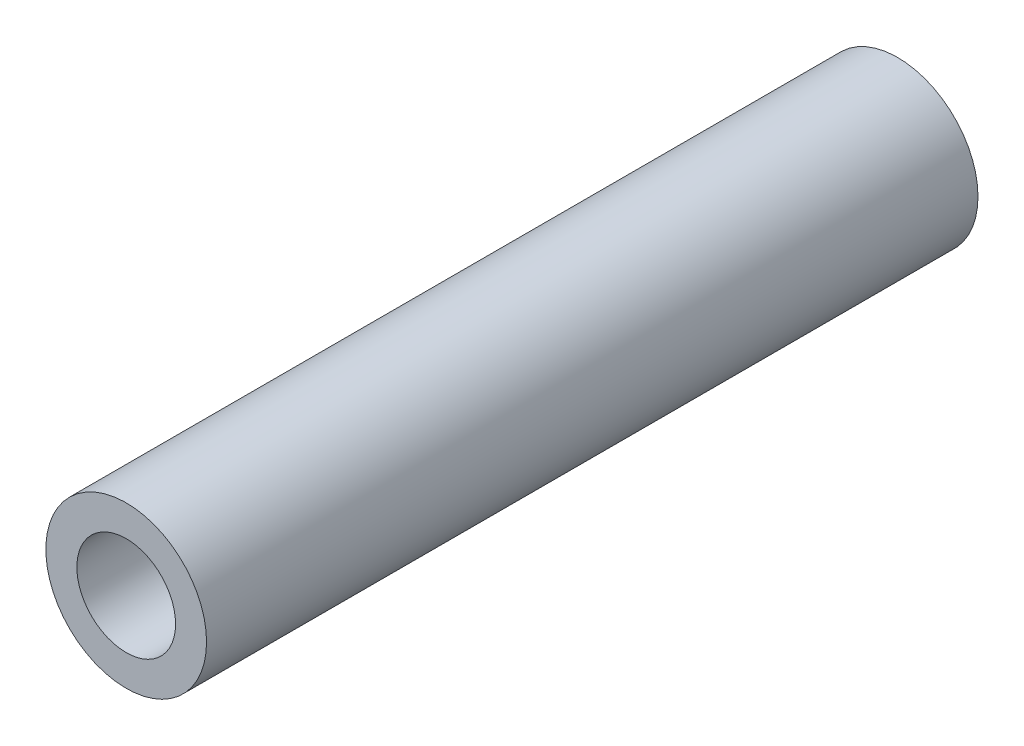
ISO-10303-21;
HEADER;
FILE_DESCRIPTION(('STEP AP214'),'2;1');
FILE_NAME('part.step','',(''),(''),'','','');
FILE_SCHEMA(('AUTOMOTIVE_DESIGN { 1 0 10303 214 1 1 1 1 }'));
ENDSEC;
DATA;
#1=APPLICATION_CONTEXT('core data for automotive mechanical design processes');
#2=APPLICATION_PROTOCOL_DEFINITION('international standard','automotive_design',2000,#1);
#3=PRODUCT_CONTEXT('',#1,'mechanical');
#4=PRODUCT('Part','Part','',(#3));
#5=PRODUCT_RELATED_PRODUCT_CATEGORY('part','',(#4));
#6=PRODUCT_DEFINITION_FORMATION('','',#4);
#7=PRODUCT_DEFINITION_CONTEXT('part definition',#1,'design');
#8=PRODUCT_DEFINITION('design','',#6,#7);
#9=PRODUCT_DEFINITION_SHAPE('','',#8);
#10=(LENGTH_UNIT() NAMED_UNIT(*) SI_UNIT(.MILLI.,.METRE.));
#11=(NAMED_UNIT(*) PLANE_ANGLE_UNIT() SI_UNIT($,.RADIAN.));
#12=(NAMED_UNIT(*) SI_UNIT($,.STERADIAN.) SOLID_ANGLE_UNIT());
#13=UNCERTAINTY_MEASURE_WITH_UNIT(LENGTH_MEASURE(1.E-05),#10,'distance_accuracy_value','');
#14=(GEOMETRIC_REPRESENTATION_CONTEXT(3) GLOBAL_UNCERTAINTY_ASSIGNED_CONTEXT((#13)) GLOBAL_UNIT_ASSIGNED_CONTEXT((#10,
#11,#12)) REPRESENTATION_CONTEXT('',''));
#15=CARTESIAN_POINT('',(0.,0.,0.));
#16=DIRECTION('',(0.,0.,1.));
#17=DIRECTION('',(1.,0.,0.));
#18=AXIS2_PLACEMENT_3D('',#15,#16,#17);
#19=CARTESIAN_POINT('',(0.,0.,19.05));
#20=DIRECTION('',(0.,0.,-1.));
#21=DIRECTION('',(-1.,0.,0.));
#22=AXIS2_PLACEMENT_3D('',#19,#20,#21);
#23=CYLINDRICAL_SURFACE('',#22,2.4384);
#24=CARTESIAN_POINT('',(0.,0.,19.05));
#25=DIRECTION('',(0.,0.,1.));
#26=DIRECTION('',(1.,0.,0.));
#27=AXIS2_PLACEMENT_3D('',#24,#25,#26);
#28=CIRCLE('',#27,2.4384);
#29=CARTESIAN_POINT('',(2.4384,0.,19.05));
#30=VERTEX_POINT('',#29);
#31=EDGE_CURVE('E54',#30,#30,#28,.T.);
#32=ORIENTED_EDGE('',*,*,#31,.T.);
#33=EDGE_LOOP('',(#32));
#34=FACE_BOUND('',#33,.T.);
#35=CARTESIAN_POINT('',(0.,0.,-19.05));
#36=DIRECTION('',(0.,0.,1.));
#37=DIRECTION('',(1.,0.,0.));
#38=AXIS2_PLACEMENT_3D('',#35,#36,#37);
#39=CIRCLE('',#38,2.4384);
#40=CARTESIAN_POINT('',(2.4384,0.,-19.05));
#41=VERTEX_POINT('',#40);
#42=EDGE_CURVE('E11',#41,#41,#39,.T.);
#43=ORIENTED_EDGE('',*,*,#42,.F.);
#44=EDGE_LOOP('',(#43));
#45=FACE_BOUND('',#44,.T.);
#46=ADVANCED_FACE('F16',(#34,#45),#23,.F.);
#47=CARTESIAN_POINT('',(0.,0.,19.05));
#48=DIRECTION('',(0.,0.,-1.));
#49=DIRECTION('',(-1.,0.,0.));
#50=AXIS2_PLACEMENT_3D('',#47,#48,#49);
#51=CYLINDRICAL_SURFACE('',#50,3.96875);
#52=CARTESIAN_POINT('',(0.,0.,19.05));
#53=DIRECTION('',(0.,0.,1.));
#54=DIRECTION('',(1.,0.,0.));
#55=AXIS2_PLACEMENT_3D('',#52,#53,#54);
#56=CIRCLE('',#55,3.96875);
#57=CARTESIAN_POINT('',(3.96875,0.,19.05));
#58=VERTEX_POINT('',#57);
#59=EDGE_CURVE('E20',#58,#58,#56,.T.);
#60=ORIENTED_EDGE('',*,*,#59,.F.);
#61=EDGE_LOOP('',(#60));
#62=FACE_BOUND('',#61,.T.);
#63=CARTESIAN_POINT('',(0.,0.,-19.05));
#64=DIRECTION('',(0.,0.,1.));
#65=DIRECTION('',(1.,0.,0.));
#66=AXIS2_PLACEMENT_3D('',#63,#64,#65);
#67=CIRCLE('',#66,3.96875);
#68=CARTESIAN_POINT('',(3.96875,0.,-19.05));
#69=VERTEX_POINT('',#68);
#70=EDGE_CURVE('E27',#69,#69,#67,.T.);
#71=ORIENTED_EDGE('',*,*,#70,.T.);
#72=EDGE_LOOP('',(#71));
#73=FACE_BOUND('',#72,.T.);
#74=ADVANCED_FACE('F83',(#62,#73),#51,.T.);
#75=CARTESIAN_POINT('',(0.,0.,-19.05));
#76=DIRECTION('',(0.,0.,1.));
#77=DIRECTION('',(1.,0.,0.));
#78=AXIS2_PLACEMENT_3D('',#75,#76,#77);
#79=PLANE('',#78);
#80=ORIENTED_EDGE('',*,*,#42,.T.);
#81=EDGE_LOOP('',(#80));
#82=FACE_BOUND('',#81,.T.);
#83=ORIENTED_EDGE('',*,*,#70,.F.);
#84=EDGE_LOOP('',(#83));
#85=FACE_BOUND('',#84,.T.);
#86=ADVANCED_FACE('F18',(#82,#85),#79,.F.);
#87=CARTESIAN_POINT('',(0.,0.,19.05));
#88=DIRECTION('',(0.,0.,1.));
#89=DIRECTION('',(1.,0.,0.));
#90=AXIS2_PLACEMENT_3D('',#87,#88,#89);
#91=PLANE('',#90);
#92=ORIENTED_EDGE('',*,*,#31,.F.);
#93=EDGE_LOOP('',(#92));
#94=FACE_BOUND('',#93,.T.);
#95=ORIENTED_EDGE('',*,*,#59,.T.);
#96=EDGE_LOOP('',(#95));
#97=FACE_BOUND('',#96,.T.);
#98=ADVANCED_FACE('F90',(#94,#97),#91,.T.);
#99=CLOSED_SHELL('',(#46,#74,#86,#98));
#100=MANIFOLD_SOLID_BREP('B1',#99);
#101=ADVANCED_BREP_SHAPE_REPRESENTATION('',(#18,#100),#14);
#102=SHAPE_DEFINITION_REPRESENTATION(#9,#101);
ENDSEC;
END-ISO-10303-21;
